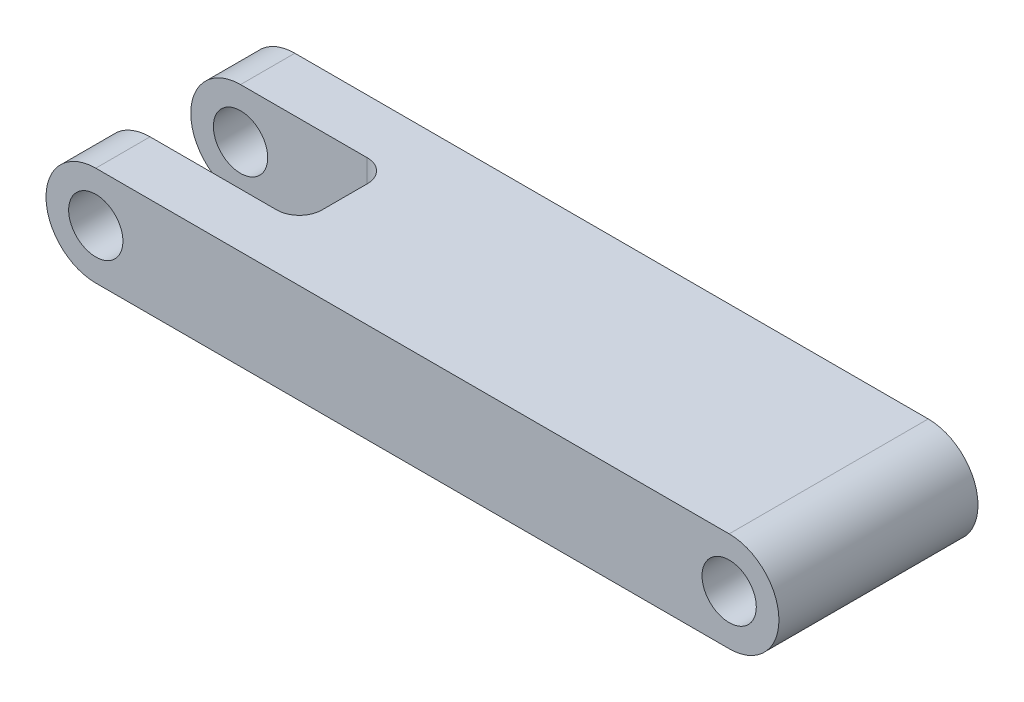
ISO-10303-21;
HEADER;
FILE_DESCRIPTION(('STEP AP214'),'2;1');
FILE_NAME('part.step','',(''),(''),'','','');
FILE_SCHEMA(('AUTOMOTIVE_DESIGN { 1 0 10303 214 1 1 1 1 }'));
ENDSEC;
DATA;
#1=APPLICATION_CONTEXT('core data for automotive mechanical design processes');
#2=APPLICATION_PROTOCOL_DEFINITION('international standard','automotive_design',2000,#1);
#3=PRODUCT_CONTEXT('',#1,'mechanical');
#4=PRODUCT('Part','Part','',(#3));
#5=PRODUCT_RELATED_PRODUCT_CATEGORY('part','',(#4));
#6=PRODUCT_DEFINITION_FORMATION('','',#4);
#7=PRODUCT_DEFINITION_CONTEXT('part definition',#1,'design');
#8=PRODUCT_DEFINITION('design','',#6,#7);
#9=PRODUCT_DEFINITION_SHAPE('','',#8);
#10=(LENGTH_UNIT() NAMED_UNIT(*) SI_UNIT(.MILLI.,.METRE.));
#11=(NAMED_UNIT(*) PLANE_ANGLE_UNIT() SI_UNIT($,.RADIAN.));
#12=(NAMED_UNIT(*) SI_UNIT($,.STERADIAN.) SOLID_ANGLE_UNIT());
#13=UNCERTAINTY_MEASURE_WITH_UNIT(LENGTH_MEASURE(1.E-05),#10,'distance_accuracy_value','');
#14=(GEOMETRIC_REPRESENTATION_CONTEXT(3) GLOBAL_UNCERTAINTY_ASSIGNED_CONTEXT((#13)) GLOBAL_UNIT_ASSIGNED_CONTEXT((#10,
#11,#12)) REPRESENTATION_CONTEXT('',''));
#15=CARTESIAN_POINT('',(0.,0.,0.));
#16=DIRECTION('',(0.,0.,1.));
#17=DIRECTION('',(1.,0.,0.));
#18=AXIS2_PLACEMENT_3D('',#15,#16,#17);
#19=CARTESIAN_POINT('',(0.,0.,44.));
#20=DIRECTION('',(0.,0.,-1.));
#21=DIRECTION('',(-1.,0.,0.));
#22=AXIS2_PLACEMENT_3D('',#19,#20,#21);
#23=CYLINDRICAL_SURFACE('',#22,11.);
#24=DIRECTION('',(0.,0.,-1.));
#25=VECTOR('',#24,1.);
#26=CARTESIAN_POINT('',(0.,11.,44.));
#27=LINE('',#26,#25);
#28=CARTESIAN_POINT('',(0.,11.,44.));
#29=VERTEX_POINT('',#28);
#30=CARTESIAN_POINT('',(0.,11.,32.));
#31=VERTEX_POINT('',#30);
#32=EDGE_CURVE('E136',#29,#31,#27,.T.);
#33=ORIENTED_EDGE('',*,*,#32,.T.);
#34=CARTESIAN_POINT('',(0.,0.,32.));
#35=DIRECTION('',(0.,0.,1.));
#36=DIRECTION('',(1.,0.,0.));
#37=AXIS2_PLACEMENT_3D('',#34,#35,#36);
#38=CIRCLE('',#37,11.);
#39=CARTESIAN_POINT('',(0.,-11.,32.));
#40=VERTEX_POINT('',#39);
#41=EDGE_CURVE('E159',#31,#40,#38,.T.);
#42=ORIENTED_EDGE('',*,*,#41,.T.);
#43=DIRECTION('',(0.,0.,-1.));
#44=VECTOR('',#43,1.);
#45=CARTESIAN_POINT('',(0.,-11.,44.));
#46=LINE('',#45,#44);
#47=CARTESIAN_POINT('',(0.,-11.,44.));
#48=VERTEX_POINT('',#47);
#49=EDGE_CURVE('E150',#48,#40,#46,.T.);
#50=ORIENTED_EDGE('',*,*,#49,.F.);
#51=CARTESIAN_POINT('',(0.,0.,44.));
#52=DIRECTION('',(0.,0.,1.));
#53=DIRECTION('',(1.,0.,0.));
#54=AXIS2_PLACEMENT_3D('',#51,#52,#53);
#55=CIRCLE('',#54,11.);
#56=EDGE_CURVE('E227',#29,#48,#55,.T.);
#57=ORIENTED_EDGE('',*,*,#56,.F.);
#58=EDGE_LOOP('',(#33,#42,#50,#57));
#59=FACE_BOUND('',#58,.T.);
#60=ADVANCED_FACE('F34',(#59),#23,.T.);
#61=CARTESIAN_POINT('',(0.,0.,44.));
#62=DIRECTION('',(0.,0.,-1.));
#63=DIRECTION('',(-1.,0.,0.));
#64=AXIS2_PLACEMENT_3D('',#61,#62,#63);
#65=CYLINDRICAL_SURFACE('',#64,6.);
#66=CARTESIAN_POINT('',(0.,0.,32.));
#67=DIRECTION('',(0.,0.,1.));
#68=DIRECTION('',(1.,0.,0.));
#69=AXIS2_PLACEMENT_3D('',#66,#67,#68);
#70=CIRCLE('',#69,6.);
#71=CARTESIAN_POINT('',(6.,0.,32.));
#72=VERTEX_POINT('',#71);
#73=EDGE_CURVE('E127',#72,#72,#70,.T.);
#74=ORIENTED_EDGE('',*,*,#73,.F.);
#75=EDGE_LOOP('',(#74));
#76=FACE_BOUND('',#75,.T.);
#77=CARTESIAN_POINT('',(0.,0.,44.));
#78=DIRECTION('',(0.,0.,1.));
#79=DIRECTION('',(1.,0.,0.));
#80=AXIS2_PLACEMENT_3D('',#77,#78,#79);
#81=CIRCLE('',#80,6.);
#82=CARTESIAN_POINT('',(6.,0.,44.));
#83=VERTEX_POINT('',#82);
#84=EDGE_CURVE('E241',#83,#83,#81,.T.);
#85=ORIENTED_EDGE('',*,*,#84,.T.);
#86=EDGE_LOOP('',(#85));
#87=FACE_BOUND('',#86,.T.);
#88=ADVANCED_FACE('F183',(#76,#87),#65,.F.);
#89=CARTESIAN_POINT('',(0.,0.,44.));
#90=DIRECTION('',(0.,0.,1.));
#91=DIRECTION('',(1.,0.,0.));
#92=AXIS2_PLACEMENT_3D('',#89,#90,#91);
#93=PLANE('',#92);
#94=ORIENTED_EDGE('',*,*,#84,.F.);
#95=EDGE_LOOP('',(#94));
#96=FACE_BOUND('',#95,.T.);
#97=ORIENTED_EDGE('',*,*,#56,.T.);
#98=DIRECTION('',(1.,0.,0.));
#99=VECTOR('',#98,1.);
#100=CARTESIAN_POINT('',(0.,-11.,44.));
#101=LINE('',#100,#99);
#102=CARTESIAN_POINT('',(140.,-11.,44.));
#103=VERTEX_POINT('',#102);
#104=EDGE_CURVE('E229',#48,#103,#101,.T.);
#105=ORIENTED_EDGE('',*,*,#104,.T.);
#106=CARTESIAN_POINT('',(140.,0.,44.));
#107=DIRECTION('',(0.,0.,1.));
#108=DIRECTION('',(1.,0.,0.));
#109=AXIS2_PLACEMENT_3D('',#106,#107,#108);
#110=CIRCLE('',#109,11.);
#111=CARTESIAN_POINT('',(140.,11.,44.));
#112=VERTEX_POINT('',#111);
#113=EDGE_CURVE('E141',#103,#112,#110,.T.);
#114=ORIENTED_EDGE('',*,*,#113,.T.);
#115=DIRECTION('',(-1.,0.,0.));
#116=VECTOR('',#115,1.);
#117=CARTESIAN_POINT('',(0.,11.,44.));
#118=LINE('',#117,#116);
#119=EDGE_CURVE('E137',#112,#29,#118,.T.);
#120=ORIENTED_EDGE('',*,*,#119,.T.);
#121=EDGE_LOOP('',(#97,#105,#114,#120));
#122=FACE_BOUND('',#121,.T.);
#123=CARTESIAN_POINT('',(140.,0.,44.));
#124=DIRECTION('',(0.,0.,1.));
#125=DIRECTION('',(1.,0.,0.));
#126=AXIS2_PLACEMENT_3D('',#123,#124,#125);
#127=CIRCLE('',#126,6.00000000000002);
#128=CARTESIAN_POINT('',(146.,0.,44.));
#129=VERTEX_POINT('',#128);
#130=EDGE_CURVE('E254',#129,#129,#127,.T.);
#131=ORIENTED_EDGE('',*,*,#130,.F.);
#132=EDGE_LOOP('',(#131));
#133=FACE_BOUND('',#132,.T.);
#134=ADVANCED_FACE('F189',(#96,#122,#133),#93,.T.);
#135=CARTESIAN_POINT('',(0.,0.,0.));
#136=DIRECTION('',(0.,0.,1.));
#137=DIRECTION('',(1.,0.,0.));
#138=AXIS2_PLACEMENT_3D('',#135,#136,#137);
#139=PLANE('',#138);
#140=CARTESIAN_POINT('',(0.,0.,0.));
#141=DIRECTION('',(0.,0.,1.));
#142=DIRECTION('',(1.,0.,0.));
#143=AXIS2_PLACEMENT_3D('',#140,#141,#142);
#144=CIRCLE('',#143,11.);
#145=CARTESIAN_POINT('',(0.,11.,0.));
#146=VERTEX_POINT('',#145);
#147=CARTESIAN_POINT('',(0.,-11.,0.));
#148=VERTEX_POINT('',#147);
#149=EDGE_CURVE('E226',#146,#148,#144,.T.);
#150=ORIENTED_EDGE('',*,*,#149,.F.);
#151=DIRECTION('',(-1.,0.,0.));
#152=VECTOR('',#151,1.);
#153=CARTESIAN_POINT('',(0.,11.,0.));
#154=LINE('',#153,#152);
#155=CARTESIAN_POINT('',(140.,11.,0.));
#156=VERTEX_POINT('',#155);
#157=EDGE_CURVE('E134',#156,#146,#154,.T.);
#158=ORIENTED_EDGE('',*,*,#157,.F.);
#159=CARTESIAN_POINT('',(140.,0.,0.));
#160=DIRECTION('',(0.,0.,1.));
#161=DIRECTION('',(1.,0.,0.));
#162=AXIS2_PLACEMENT_3D('',#159,#160,#161);
#163=CIRCLE('',#162,11.);
#164=CARTESIAN_POINT('',(140.,-11.,0.));
#165=VERTEX_POINT('',#164);
#166=EDGE_CURVE('E219',#165,#156,#163,.T.);
#167=ORIENTED_EDGE('',*,*,#166,.F.);
#168=DIRECTION('',(1.,0.,0.));
#169=VECTOR('',#168,1.);
#170=CARTESIAN_POINT('',(0.,-11.,0.));
#171=LINE('',#170,#169);
#172=EDGE_CURVE('E224',#148,#165,#171,.T.);
#173=ORIENTED_EDGE('',*,*,#172,.F.);
#174=EDGE_LOOP('',(#150,#158,#167,#173));
#175=FACE_BOUND('',#174,.T.);
#176=CARTESIAN_POINT('',(0.,0.,0.));
#177=DIRECTION('',(0.,0.,1.));
#178=DIRECTION('',(1.,0.,0.));
#179=AXIS2_PLACEMENT_3D('',#176,#177,#178);
#180=CIRCLE('',#179,6.);
#181=CARTESIAN_POINT('',(6.,0.,0.));
#182=VERTEX_POINT('',#181);
#183=EDGE_CURVE('E236',#182,#182,#180,.T.);
#184=ORIENTED_EDGE('',*,*,#183,.T.);
#185=EDGE_LOOP('',(#184));
#186=FACE_BOUND('',#185,.T.);
#187=CARTESIAN_POINT('',(140.,0.,0.));
#188=DIRECTION('',(0.,0.,1.));
#189=DIRECTION('',(1.,0.,0.));
#190=AXIS2_PLACEMENT_3D('',#187,#188,#189);
#191=CIRCLE('',#190,6.00000000000002);
#192=CARTESIAN_POINT('',(146.,0.,0.));
#193=VERTEX_POINT('',#192);
#194=EDGE_CURVE('E253',#193,#193,#191,.T.);
#195=ORIENTED_EDGE('',*,*,#194,.T.);
#196=EDGE_LOOP('',(#195));
#197=FACE_BOUND('',#196,.T.);
#198=ADVANCED_FACE('F196',(#175,#186,#197),#139,.F.);
#199=CARTESIAN_POINT('',(0.,-11.,12.));
#200=VERTEX_POINT('',#199);
#201=EDGE_CURVE('E126',#200,#148,#46,.T.);
#202=ORIENTED_EDGE('',*,*,#201,.F.);
#203=CARTESIAN_POINT('',(0.,0.,12.));
#204=DIRECTION('',(0.,0.,-1.));
#205=DIRECTION('',(-1.,0.,0.));
#206=AXIS2_PLACEMENT_3D('',#203,#204,#205);
#207=CIRCLE('',#206,11.);
#208=CARTESIAN_POINT('',(0.,11.,12.));
#209=VERTEX_POINT('',#208);
#210=EDGE_CURVE('E113',#200,#209,#207,.T.);
#211=ORIENTED_EDGE('',*,*,#210,.T.);
#212=EDGE_CURVE('E124',#209,#146,#27,.T.);
#213=ORIENTED_EDGE('',*,*,#212,.T.);
#214=ORIENTED_EDGE('',*,*,#149,.T.);
#215=EDGE_LOOP('',(#202,#211,#213,#214));
#216=FACE_BOUND('',#215,.T.);
#217=ADVANCED_FACE('F122',(#216),#23,.T.);
#218=CARTESIAN_POINT('',(0.,-11.,44.));
#219=DIRECTION('',(0.,1.,0.));
#220=DIRECTION('',(-1.,0.,0.));
#221=AXIS2_PLACEMENT_3D('',#218,#219,#220);
#222=PLANE('',#221);
#223=ORIENTED_EDGE('',*,*,#49,.T.);
#224=DIRECTION('',(1.,0.,0.));
#225=VECTOR('',#224,1.);
#226=CARTESIAN_POINT('',(-55.,-11.,32.));
#227=LINE('',#226,#225);
#228=CARTESIAN_POINT('',(28.,-11.,32.));
#229=VERTEX_POINT('',#228);
#230=EDGE_CURVE('E156',#40,#229,#227,.T.);
#231=ORIENTED_EDGE('',*,*,#230,.T.);
#232=CARTESIAN_POINT('',(28.,-11.,27.));
#233=DIRECTION('',(0.,1.,0.));
#234=DIRECTION('',(-1.,0.,0.));
#235=AXIS2_PLACEMENT_3D('',#232,#233,#234);
#236=CIRCLE('',#235,5.);
#237=CARTESIAN_POINT('',(33.,-11.,27.));
#238=VERTEX_POINT('',#237);
#239=EDGE_CURVE('E169',#229,#238,#236,.T.);
#240=ORIENTED_EDGE('',*,*,#239,.T.);
#241=DIRECTION('',(0.,0.,-1.));
#242=VECTOR('',#241,1.);
#243=CARTESIAN_POINT('',(33.,-11.,32.));
#244=LINE('',#243,#242);
#245=CARTESIAN_POINT('',(33.,-11.,17.));
#246=VERTEX_POINT('',#245);
#247=EDGE_CURVE('E243',#238,#246,#244,.T.);
#248=ORIENTED_EDGE('',*,*,#247,.T.);
#249=CARTESIAN_POINT('',(28.,-11.,17.));
#250=DIRECTION('',(0.,1.,0.));
#251=DIRECTION('',(-1.,0.,0.));
#252=AXIS2_PLACEMENT_3D('',#249,#250,#251);
#253=CIRCLE('',#252,5.);
#254=CARTESIAN_POINT('',(28.,-11.,12.));
#255=VERTEX_POINT('',#254);
#256=EDGE_CURVE('E11',#246,#255,#253,.T.);
#257=ORIENTED_EDGE('',*,*,#256,.T.);
#258=DIRECTION('',(-1.,0.,0.));
#259=VECTOR('',#258,1.);
#260=CARTESIAN_POINT('',(-55.,-11.,12.));
#261=LINE('',#260,#259);
#262=EDGE_CURVE('E242',#255,#200,#261,.T.);
#263=ORIENTED_EDGE('',*,*,#262,.T.);
#264=ORIENTED_EDGE('',*,*,#201,.T.);
#265=ORIENTED_EDGE('',*,*,#172,.T.);
#266=DIRECTION('',(0.,0.,-1.));
#267=VECTOR('',#266,1.);
#268=CARTESIAN_POINT('',(140.,-11.,44.));
#269=LINE('',#268,#267);
#270=EDGE_CURVE('E147',#103,#165,#269,.T.);
#271=ORIENTED_EDGE('',*,*,#270,.F.);
#272=ORIENTED_EDGE('',*,*,#104,.F.);
#273=EDGE_LOOP('',(#223,#231,#240,#248,#257,#263,#264,#265,#271,#272));
#274=FACE_BOUND('',#273,.T.);
#275=ADVANCED_FACE('F195',(#274),#222,.F.);
#276=CARTESIAN_POINT('',(140.,0.,44.));
#277=DIRECTION('',(0.,0.,-1.));
#278=DIRECTION('',(-1.,0.,0.));
#279=AXIS2_PLACEMENT_3D('',#276,#277,#278);
#280=CYLINDRICAL_SURFACE('',#279,11.);
#281=ORIENTED_EDGE('',*,*,#166,.T.);
#282=DIRECTION('',(0.,0.,-1.));
#283=VECTOR('',#282,1.);
#284=CARTESIAN_POINT('',(140.,11.,44.));
#285=LINE('',#284,#283);
#286=EDGE_CURVE('E140',#112,#156,#285,.T.);
#287=ORIENTED_EDGE('',*,*,#286,.F.);
#288=ORIENTED_EDGE('',*,*,#113,.F.);
#289=ORIENTED_EDGE('',*,*,#270,.T.);
#290=EDGE_LOOP('',(#281,#287,#288,#289));
#291=FACE_BOUND('',#290,.T.);
#292=ADVANCED_FACE('F201',(#291),#280,.T.);
#293=CARTESIAN_POINT('',(0.,11.,44.));
#294=DIRECTION('',(0.,-1.,0.));
#295=DIRECTION('',(1.,0.,0.));
#296=AXIS2_PLACEMENT_3D('',#293,#294,#295);
#297=PLANE('',#296);
#298=DIRECTION('',(0.,0.,-1.));
#299=VECTOR('',#298,1.);
#300=CARTESIAN_POINT('',(33.,11.,32.));
#301=LINE('',#300,#299);
#302=CARTESIAN_POINT('',(33.,11.,27.));
#303=VERTEX_POINT('',#302);
#304=CARTESIAN_POINT('',(33.,11.,17.));
#305=VERTEX_POINT('',#304);
#306=EDGE_CURVE('E119',#303,#305,#301,.T.);
#307=ORIENTED_EDGE('',*,*,#306,.F.);
#308=CARTESIAN_POINT('',(28.,11.,27.));
#309=DIRECTION('',(0.,-1.,0.));
#310=DIRECTION('',(1.,0.,0.));
#311=AXIS2_PLACEMENT_3D('',#308,#309,#310);
#312=CIRCLE('',#311,5.);
#313=CARTESIAN_POINT('',(28.,11.,32.));
#314=VERTEX_POINT('',#313);
#315=EDGE_CURVE('E167',#303,#314,#312,.T.);
#316=ORIENTED_EDGE('',*,*,#315,.T.);
#317=DIRECTION('',(1.,0.,0.));
#318=VECTOR('',#317,1.);
#319=CARTESIAN_POINT('',(-55.,11.,32.));
#320=LINE('',#319,#318);
#321=EDGE_CURVE('E118',#31,#314,#320,.T.);
#322=ORIENTED_EDGE('',*,*,#321,.F.);
#323=ORIENTED_EDGE('',*,*,#32,.F.);
#324=ORIENTED_EDGE('',*,*,#119,.F.);
#325=ORIENTED_EDGE('',*,*,#286,.T.);
#326=ORIENTED_EDGE('',*,*,#157,.T.);
#327=ORIENTED_EDGE('',*,*,#212,.F.);
#328=DIRECTION('',(-1.,0.,0.));
#329=VECTOR('',#328,1.);
#330=CARTESIAN_POINT('',(-55.,11.,12.));
#331=LINE('',#330,#329);
#332=CARTESIAN_POINT('',(28.,11.,12.));
#333=VERTEX_POINT('',#332);
#334=EDGE_CURVE('E110',#333,#209,#331,.T.);
#335=ORIENTED_EDGE('',*,*,#334,.F.);
#336=CARTESIAN_POINT('',(28.,11.,17.));
#337=DIRECTION('',(0.,-1.,0.));
#338=DIRECTION('',(1.,0.,0.));
#339=AXIS2_PLACEMENT_3D('',#336,#337,#338);
#340=CIRCLE('',#339,5.);
#341=EDGE_CURVE('E42',#333,#305,#340,.T.);
#342=ORIENTED_EDGE('',*,*,#341,.T.);
#343=EDGE_LOOP('',(#307,#316,#322,#323,#324,#325,#326,#327,#335,#342));
#344=FACE_BOUND('',#343,.T.);
#345=ADVANCED_FACE('F131',(#344),#297,.F.);
#346=CARTESIAN_POINT('',(0.,0.,12.));
#347=DIRECTION('',(0.,0.,-1.));
#348=DIRECTION('',(-1.,0.,0.));
#349=AXIS2_PLACEMENT_3D('',#346,#347,#348);
#350=CIRCLE('',#349,6.);
#351=CARTESIAN_POINT('',(-6.,0.,12.));
#352=VERTEX_POINT('',#351);
#353=EDGE_CURVE('E128',#352,#352,#350,.T.);
#354=ORIENTED_EDGE('',*,*,#353,.F.);
#355=EDGE_LOOP('',(#354));
#356=FACE_BOUND('',#355,.T.);
#357=ORIENTED_EDGE('',*,*,#183,.F.);
#358=EDGE_LOOP('',(#357));
#359=FACE_BOUND('',#358,.T.);
#360=ADVANCED_FACE('F192',(#356,#359),#65,.F.);
#361=CARTESIAN_POINT('',(140.,0.,44.));
#362=DIRECTION('',(0.,0.,-1.));
#363=DIRECTION('',(-1.,0.,0.));
#364=AXIS2_PLACEMENT_3D('',#361,#362,#363);
#365=CYLINDRICAL_SURFACE('',#364,6.00000000000002);
#366=ORIENTED_EDGE('',*,*,#130,.T.);
#367=EDGE_LOOP('',(#366));
#368=FACE_BOUND('',#367,.T.);
#369=ORIENTED_EDGE('',*,*,#194,.F.);
#370=EDGE_LOOP('',(#369));
#371=FACE_BOUND('',#370,.T.);
#372=ADVANCED_FACE('F266',(#368,#371),#365,.F.);
#373=CARTESIAN_POINT('',(-55.,-11.,32.));
#374=DIRECTION('',(0.,0.,1.));
#375=DIRECTION('',(1.,0.,0.));
#376=AXIS2_PLACEMENT_3D('',#373,#374,#375);
#377=PLANE('',#376);
#378=ORIENTED_EDGE('',*,*,#73,.T.);
#379=EDGE_LOOP('',(#378));
#380=FACE_BOUND('',#379,.T.);
#381=ORIENTED_EDGE('',*,*,#321,.T.);
#382=DIRECTION('',(0.,1.,0.));
#383=VECTOR('',#382,1.);
#384=CARTESIAN_POINT('',(28.,-11.,32.));
#385=LINE('',#384,#383);
#386=EDGE_CURVE('E164',#314,#229,#385,.F.);
#387=ORIENTED_EDGE('',*,*,#386,.T.);
#388=ORIENTED_EDGE('',*,*,#230,.F.);
#389=ORIENTED_EDGE('',*,*,#41,.F.);
#390=EDGE_LOOP('',(#381,#387,#388,#389));
#391=FACE_BOUND('',#390,.T.);
#392=ADVANCED_FACE('F271',(#380,#391),#377,.F.);
#393=CARTESIAN_POINT('',(-55.,-11.,12.));
#394=DIRECTION('',(0.,0.,-1.));
#395=DIRECTION('',(-1.,0.,0.));
#396=AXIS2_PLACEMENT_3D('',#393,#394,#395);
#397=PLANE('',#396);
#398=ORIENTED_EDGE('',*,*,#353,.T.);
#399=EDGE_LOOP('',(#398));
#400=FACE_BOUND('',#399,.T.);
#401=ORIENTED_EDGE('',*,*,#262,.F.);
#402=DIRECTION('',(0.,1.,0.));
#403=VECTOR('',#402,1.);
#404=CARTESIAN_POINT('',(28.,11.,12.));
#405=LINE('',#404,#403);
#406=EDGE_CURVE('E115',#255,#333,#405,.T.);
#407=ORIENTED_EDGE('',*,*,#406,.T.);
#408=ORIENTED_EDGE('',*,*,#334,.T.);
#409=ORIENTED_EDGE('',*,*,#210,.F.);
#410=EDGE_LOOP('',(#401,#407,#408,#409));
#411=FACE_BOUND('',#410,.T.);
#412=ADVANCED_FACE('F112',(#400,#411),#397,.F.);
#413=CARTESIAN_POINT('',(33.,-11.,32.));
#414=DIRECTION('',(1.,0.,0.));
#415=DIRECTION('',(0.,1.,0.));
#416=AXIS2_PLACEMENT_3D('',#413,#414,#415);
#417=PLANE('',#416);
#418=ORIENTED_EDGE('',*,*,#247,.F.);
#419=DIRECTION('',(0.,1.,0.));
#420=VECTOR('',#419,1.);
#421=CARTESIAN_POINT('',(33.,11.,27.));
#422=LINE('',#421,#420);
#423=EDGE_CURVE('E161',#238,#303,#422,.T.);
#424=ORIENTED_EDGE('',*,*,#423,.T.);
#425=ORIENTED_EDGE('',*,*,#306,.T.);
#426=DIRECTION('',(0.,1.,0.));
#427=VECTOR('',#426,1.);
#428=CARTESIAN_POINT('',(33.,-11.,17.));
#429=LINE('',#428,#427);
#430=EDGE_CURVE('E153',#305,#246,#429,.F.);
#431=ORIENTED_EDGE('',*,*,#430,.T.);
#432=EDGE_LOOP('',(#418,#424,#425,#431));
#433=FACE_BOUND('',#432,.T.);
#434=ADVANCED_FACE('F173',(#433),#417,.F.);
#435=CARTESIAN_POINT('',(28.,-11.,27.));
#436=DIRECTION('',(0.,-1.,0.));
#437=DIRECTION('',(1.,0.,0.));
#438=AXIS2_PLACEMENT_3D('',#435,#436,#437);
#439=CYLINDRICAL_SURFACE('',#438,5.);
#440=ORIENTED_EDGE('',*,*,#239,.F.);
#441=ORIENTED_EDGE('',*,*,#386,.F.);
#442=ORIENTED_EDGE('',*,*,#315,.F.);
#443=ORIENTED_EDGE('',*,*,#423,.F.);
#444=EDGE_LOOP('',(#440,#441,#442,#443));
#445=FACE_BOUND('',#444,.T.);
#446=ADVANCED_FACE('F177',(#445),#439,.F.);
#447=CARTESIAN_POINT('',(28.,-11.,17.));
#448=DIRECTION('',(0.,-1.,0.));
#449=DIRECTION('',(1.,0.,0.));
#450=AXIS2_PLACEMENT_3D('',#447,#448,#449);
#451=CYLINDRICAL_SURFACE('',#450,5.);
#452=ORIENTED_EDGE('',*,*,#256,.F.);
#453=ORIENTED_EDGE('',*,*,#430,.F.);
#454=ORIENTED_EDGE('',*,*,#341,.F.);
#455=ORIENTED_EDGE('',*,*,#406,.F.);
#456=EDGE_LOOP('',(#452,#453,#454,#455));
#457=FACE_BOUND('',#456,.T.);
#458=ADVANCED_FACE('F36',(#457),#451,.F.);
#459=CLOSED_SHELL('',(#60,#88,#134,#198,#217,#275,#292,#345,#360,#372,#392,#412,#434,#446,#458));
#460=MANIFOLD_SOLID_BREP('B2',#459);
#461=ADVANCED_BREP_SHAPE_REPRESENTATION('',(#18,#460),#14);
#462=SHAPE_DEFINITION_REPRESENTATION(#9,#461);
ENDSEC;
END-ISO-10303-21;
